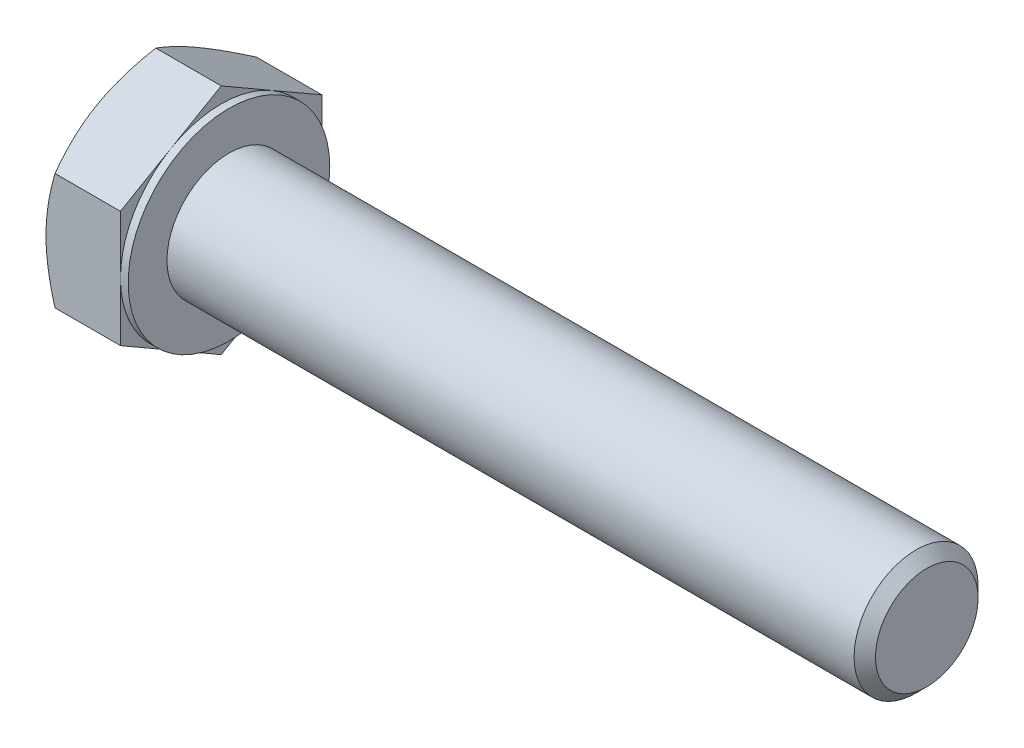
ISO-10303-21;
HEADER;
FILE_DESCRIPTION(('STEP AP214'),'2;1');
FILE_NAME('part.step','',(''),(''),'','','');
FILE_SCHEMA(('AUTOMOTIVE_DESIGN { 1 0 10303 214 1 1 1 1 }'));
ENDSEC;
DATA;
#1=APPLICATION_CONTEXT('core data for automotive mechanical design processes');
#2=APPLICATION_PROTOCOL_DEFINITION('international standard','automotive_design',2000,#1);
#3=PRODUCT_CONTEXT('',#1,'mechanical');
#4=PRODUCT('Part','Part','',(#3));
#5=PRODUCT_RELATED_PRODUCT_CATEGORY('part','',(#4));
#6=PRODUCT_DEFINITION_FORMATION('','',#4);
#7=PRODUCT_DEFINITION_CONTEXT('part definition',#1,'design');
#8=PRODUCT_DEFINITION('design','',#6,#7);
#9=PRODUCT_DEFINITION_SHAPE('','',#8);
#10=(LENGTH_UNIT() NAMED_UNIT(*) SI_UNIT(.MILLI.,.METRE.));
#11=(NAMED_UNIT(*) PLANE_ANGLE_UNIT() SI_UNIT($,.RADIAN.));
#12=(NAMED_UNIT(*) SI_UNIT($,.STERADIAN.) SOLID_ANGLE_UNIT());
#13=UNCERTAINTY_MEASURE_WITH_UNIT(LENGTH_MEASURE(1.E-05),#10,'distance_accuracy_value','');
#14=(GEOMETRIC_REPRESENTATION_CONTEXT(3) GLOBAL_UNCERTAINTY_ASSIGNED_CONTEXT((#13)) GLOBAL_UNIT_ASSIGNED_CONTEXT((#10,
#11,#12)) REPRESENTATION_CONTEXT('',''));
#15=CARTESIAN_POINT('',(0.,0.,0.));
#16=DIRECTION('',(0.,0.,1.));
#17=DIRECTION('',(1.,0.,0.));
#18=AXIS2_PLACEMENT_3D('',#15,#16,#17);
#19=CARTESIAN_POINT('',(5.3,7.50555349946514,0.));
#20=DIRECTION('',(1.,0.,0.));
#21=DIRECTION('',(0.,0.,-1.));
#22=AXIS2_PLACEMENT_3D('',#19,#20,#21);
#23=PLANE('',#22);
#24=CARTESIAN_POINT('',(5.3,0.,0.));
#25=DIRECTION('',(1.,0.,0.));
#26=DIRECTION('',(0.,0.,-1.));
#27=AXIS2_PLACEMENT_3D('',#24,#25,#26);
#28=CIRCLE('',#27,4.);
#29=CARTESIAN_POINT('',(5.3,0.,-4.));
#30=VERTEX_POINT('',#29);
#31=EDGE_CURVE('E314',#30,#30,#28,.F.);
#32=ORIENTED_EDGE('',*,*,#31,.T.);
#33=EDGE_LOOP('',(#32));
#34=FACE_BOUND('',#33,.T.);
#35=CARTESIAN_POINT('',(5.3,0.,0.));
#36=DIRECTION('',(1.,0.,0.));
#37=DIRECTION('',(0.,0.,-1.));
#38=AXIS2_PLACEMENT_3D('',#35,#36,#37);
#39=CIRCLE('',#38,6.5);
#40=CARTESIAN_POINT('',(5.3,0.,-6.5));
#41=VERTEX_POINT('',#40);
#42=EDGE_CURVE('E341',#41,#41,#39,.T.);
#43=ORIENTED_EDGE('',*,*,#42,.T.);
#44=EDGE_LOOP('',(#43));
#45=FACE_BOUND('',#44,.T.);
#46=ADVANCED_FACE('F51',(#34,#45),#23,.T.);
#47=CARTESIAN_POINT('',(0.,0.,0.));
#48=DIRECTION('',(-1.,0.,0.));
#49=DIRECTION('',(0.,0.,1.));
#50=AXIS2_PLACEMENT_3D('',#47,#48,#49);
#51=CYLINDRICAL_SURFACE('',#50,4.);
#52=ORIENTED_EDGE('',*,*,#31,.F.);
#53=EDGE_LOOP('',(#52));
#54=FACE_BOUND('',#53,.T.);
#55=CARTESIAN_POINT('',(49.6095,0.,0.));
#56=DIRECTION('',(-1.,0.,0.));
#57=DIRECTION('',(0.,0.,1.));
#58=AXIS2_PLACEMENT_3D('',#55,#56,#57);
#59=CIRCLE('',#58,4.);
#60=CARTESIAN_POINT('',(49.6095,0.,4.));
#61=VERTEX_POINT('',#60);
#62=EDGE_CURVE('E308',#61,#61,#59,.T.);
#63=ORIENTED_EDGE('',*,*,#62,.T.);
#64=EDGE_LOOP('',(#63));
#65=FACE_BOUND('',#64,.T.);
#66=ADVANCED_FACE('F279',(#54,#65),#51,.T.);
#67=CARTESIAN_POINT('',(50.3,0.,0.));
#68=DIRECTION('',(-1.,0.,0.));
#69=DIRECTION('',(0.,0.,1.));
#70=AXIS2_PLACEMENT_3D('',#67,#68,#69);
#71=CONICAL_SURFACE('',#70,3.3095,0.785398163397441);
#72=ORIENTED_EDGE('',*,*,#62,.F.);
#73=EDGE_LOOP('',(#72));
#74=FACE_BOUND('',#73,.T.);
#75=CARTESIAN_POINT('',(50.3,0.,0.));
#76=DIRECTION('',(-1.,0.,0.));
#77=DIRECTION('',(0.,0.,1.));
#78=AXIS2_PLACEMENT_3D('',#75,#76,#77);
#79=CIRCLE('',#78,3.3095);
#80=CARTESIAN_POINT('',(50.3,0.,3.3095));
#81=VERTEX_POINT('',#80);
#82=EDGE_CURVE('E305',#81,#81,#79,.T.);
#83=ORIENTED_EDGE('',*,*,#82,.T.);
#84=EDGE_LOOP('',(#83));
#85=FACE_BOUND('',#84,.T.);
#86=ADVANCED_FACE('F286',(#74,#85),#71,.T.);
#87=CARTESIAN_POINT('',(50.3,0.,0.));
#88=DIRECTION('',(-1.,0.,0.));
#89=DIRECTION('',(0.,0.,1.));
#90=AXIS2_PLACEMENT_3D('',#87,#88,#89);
#91=PLANE('',#90);
#92=ORIENTED_EDGE('',*,*,#82,.F.);
#93=EDGE_LOOP('',(#92));
#94=FACE_BOUND('',#93,.T.);
#95=ADVANCED_FACE('F293',(#94),#91,.F.);
#96=CARTESIAN_POINT('',(4.8,6.5,0.));
#97=DIRECTION('',(1.,0.,0.));
#98=DIRECTION('',(0.,0.,-1.));
#99=AXIS2_PLACEMENT_3D('',#96,#97,#98);
#100=PLANE('',#99);
#101=DIRECTION('',(0.,0.500000000000001,0.866025403784438));
#102=VECTOR('',#101,1.);
#103=CARTESIAN_POINT('',(4.8,3.75277674973256,-6.5));
#104=LINE('',#103,#102);
#105=CARTESIAN_POINT('',(4.8,3.75277674973256,-6.5));
#106=VERTEX_POINT('',#105);
#107=CARTESIAN_POINT('',(4.8,5.62916512459885,-3.25000000000001));
#108=VERTEX_POINT('',#107);
#109=EDGE_CURVE('E193',#106,#108,#104,.T.);
#110=ORIENTED_EDGE('',*,*,#109,.T.);
#111=CARTESIAN_POINT('',(4.8,0.,0.));
#112=DIRECTION('',(-1.,0.,0.));
#113=DIRECTION('',(0.,0.,1.));
#114=AXIS2_PLACEMENT_3D('',#111,#112,#113);
#115=CIRCLE('',#114,6.5);
#116=CARTESIAN_POINT('',(4.8,0.,-6.5));
#117=VERTEX_POINT('',#116);
#118=EDGE_CURVE('E68',#108,#117,#115,.T.);
#119=ORIENTED_EDGE('',*,*,#118,.T.);
#120=DIRECTION('',(0.,1.,0.));
#121=VECTOR('',#120,1.);
#122=CARTESIAN_POINT('',(4.8,3.75277674973256,-6.5));
#123=LINE('',#122,#121);
#124=EDGE_CURVE('E56',#117,#106,#123,.T.);
#125=ORIENTED_EDGE('',*,*,#124,.T.);
#126=EDGE_LOOP('',(#110,#119,#125));
#127=FACE_BOUND('',#126,.T.);
#128=ADVANCED_FACE('F296',(#127),#100,.T.);
#129=CARTESIAN_POINT('',(4.8,7.50555349946514,0.));
#130=VERTEX_POINT('',#129);
#131=EDGE_CURVE('E190',#108,#130,#104,.T.);
#132=ORIENTED_EDGE('',*,*,#131,.T.);
#133=DIRECTION('',(0.,-0.500000000000001,0.866025403784438));
#134=VECTOR('',#133,1.);
#135=CARTESIAN_POINT('',(4.8,7.50555349946514,0.));
#136=LINE('',#135,#134);
#137=CARTESIAN_POINT('',(4.8,5.62916512459885,3.25000000000001));
#138=VERTEX_POINT('',#137);
#139=EDGE_CURVE('E189',#130,#138,#136,.T.);
#140=ORIENTED_EDGE('',*,*,#139,.T.);
#141=EDGE_CURVE('E173',#138,#108,#115,.T.);
#142=ORIENTED_EDGE('',*,*,#141,.T.);
#143=EDGE_LOOP('',(#132,#140,#142));
#144=FACE_BOUND('',#143,.T.);
#145=ADVANCED_FACE('F301',(#144),#100,.T.);
#146=CARTESIAN_POINT('',(4.8,3.75277674973256,6.5));
#147=VERTEX_POINT('',#146);
#148=EDGE_CURVE('E150',#138,#147,#136,.T.);
#149=ORIENTED_EDGE('',*,*,#148,.T.);
#150=DIRECTION('',(0.,-1.,0.));
#151=VECTOR('',#150,1.);
#152=CARTESIAN_POINT('',(4.8,3.75277674973256,6.5));
#153=LINE('',#152,#151);
#154=CARTESIAN_POINT('',(4.8,0.,6.5));
#155=VERTEX_POINT('',#154);
#156=EDGE_CURVE('E144',#147,#155,#153,.T.);
#157=ORIENTED_EDGE('',*,*,#156,.T.);
#158=EDGE_CURVE('E148',#155,#138,#115,.T.);
#159=ORIENTED_EDGE('',*,*,#158,.T.);
#160=EDGE_LOOP('',(#149,#157,#159));
#161=FACE_BOUND('',#160,.T.);
#162=ADVANCED_FACE('F146',(#161),#100,.T.);
#163=CARTESIAN_POINT('',(4.8,-3.75277674973256,6.5));
#164=VERTEX_POINT('',#163);
#165=EDGE_CURVE('E155',#155,#164,#153,.T.);
#166=ORIENTED_EDGE('',*,*,#165,.T.);
#167=DIRECTION('',(0.,-0.500000000000002,-0.866025403784437));
#168=VECTOR('',#167,1.);
#169=CARTESIAN_POINT('',(4.8,-7.50555349946515,0.));
#170=LINE('',#169,#168);
#171=CARTESIAN_POINT('',(4.8,-5.62916512459884,3.25000000000001));
#172=VERTEX_POINT('',#171);
#173=EDGE_CURVE('E162',#164,#172,#170,.T.);
#174=ORIENTED_EDGE('',*,*,#173,.T.);
#175=EDGE_CURVE('E159',#172,#155,#115,.T.);
#176=ORIENTED_EDGE('',*,*,#175,.T.);
#177=EDGE_LOOP('',(#166,#174,#176));
#178=FACE_BOUND('',#177,.T.);
#179=ADVANCED_FACE('F160',(#178),#100,.T.);
#180=CARTESIAN_POINT('',(4.8,-7.50555349946515,0.));
#181=VERTEX_POINT('',#180);
#182=EDGE_CURVE('E183',#172,#181,#170,.T.);
#183=ORIENTED_EDGE('',*,*,#182,.T.);
#184=DIRECTION('',(0.,0.5,-0.866025403784439));
#185=VECTOR('',#184,1.);
#186=CARTESIAN_POINT('',(4.8,-3.75277674973258,-6.5));
#187=LINE('',#186,#185);
#188=CARTESIAN_POINT('',(4.8,-5.62916512459885,-3.25));
#189=VERTEX_POINT('',#188);
#190=EDGE_CURVE('E418',#181,#189,#187,.T.);
#191=ORIENTED_EDGE('',*,*,#190,.T.);
#192=EDGE_CURVE('E167',#189,#172,#115,.T.);
#193=ORIENTED_EDGE('',*,*,#192,.T.);
#194=EDGE_LOOP('',(#183,#191,#193));
#195=FACE_BOUND('',#194,.T.);
#196=ADVANCED_FACE('F428',(#195),#100,.T.);
#197=CARTESIAN_POINT('',(4.8,-3.75277674973258,-6.5));
#198=VERTEX_POINT('',#197);
#199=EDGE_CURVE('E175',#189,#198,#187,.T.);
#200=ORIENTED_EDGE('',*,*,#199,.T.);
#201=EDGE_CURVE('E11',#198,#117,#123,.T.);
#202=ORIENTED_EDGE('',*,*,#201,.T.);
#203=EDGE_CURVE('E412',#117,#189,#115,.T.);
#204=ORIENTED_EDGE('',*,*,#203,.T.);
#205=EDGE_LOOP('',(#200,#202,#204));
#206=FACE_BOUND('',#205,.T.);
#207=ADVANCED_FACE('F302',(#206),#100,.T.);
#208=CARTESIAN_POINT('',(0.,0.,0.));
#209=DIRECTION('',(-1.,0.,0.));
#210=DIRECTION('',(0.,0.,1.));
#211=AXIS2_PLACEMENT_3D('',#208,#209,#210);
#212=CYLINDRICAL_SURFACE('',#211,6.5);
#213=ORIENTED_EDGE('',*,*,#118,.F.);
#214=ORIENTED_EDGE('',*,*,#141,.F.);
#215=ORIENTED_EDGE('',*,*,#158,.F.);
#216=ORIENTED_EDGE('',*,*,#175,.F.);
#217=ORIENTED_EDGE('',*,*,#192,.F.);
#218=ORIENTED_EDGE('',*,*,#203,.F.);
#219=EDGE_LOOP('',(#213,#214,#215,#216,#217,#218));
#220=FACE_BOUND('',#219,.T.);
#221=ORIENTED_EDGE('',*,*,#42,.F.);
#222=EDGE_LOOP('',(#221));
#223=FACE_BOUND('',#222,.T.);
#224=ADVANCED_FACE('F170',(#220,#223),#212,.T.);
#225=CARTESIAN_POINT('',(0.,7.50555349946514,0.));
#226=DIRECTION('',(1.,0.,0.));
#227=DIRECTION('',(0.,0.,-1.));
#228=AXIS2_PLACEMENT_3D('',#225,#226,#227);
#229=PLANE('',#228);
#230=CARTESIAN_POINT('',(0.,0.,0.));
#231=DIRECTION('',(1.,0.,0.));
#232=DIRECTION('',(0.,0.,-1.));
#233=AXIS2_PLACEMENT_3D('',#230,#231,#232);
#234=CIRCLE('',#233,6.5);
#235=CARTESIAN_POINT('',(0.,0.,-6.5));
#236=VERTEX_POINT('',#235);
#237=CARTESIAN_POINT('',(0.,5.62916512459885,-3.25000000000001));
#238=VERTEX_POINT('',#237);
#239=EDGE_CURVE('E340',#236,#238,#234,.T.);
#240=ORIENTED_EDGE('',*,*,#239,.F.);
#241=CARTESIAN_POINT('',(0.,-5.62916512459885,-3.25));
#242=VERTEX_POINT('',#241);
#243=EDGE_CURVE('E336',#242,#236,#234,.T.);
#244=ORIENTED_EDGE('',*,*,#243,.F.);
#245=CARTESIAN_POINT('',(0.,-5.62916512459884,3.25000000000001));
#246=VERTEX_POINT('',#245);
#247=EDGE_CURVE('E339',#246,#242,#234,.T.);
#248=ORIENTED_EDGE('',*,*,#247,.F.);
#249=CARTESIAN_POINT('',(0.,0.,6.5));
#250=VERTEX_POINT('',#249);
#251=EDGE_CURVE('E355',#250,#246,#234,.T.);
#252=ORIENTED_EDGE('',*,*,#251,.F.);
#253=CARTESIAN_POINT('',(0.,0.,0.));
#254=DIRECTION('',(-1.,0.,0.));
#255=DIRECTION('',(0.,0.,1.));
#256=AXIS2_PLACEMENT_3D('',#253,#254,#255);
#257=CIRCLE('',#256,6.5);
#258=CARTESIAN_POINT('',(0.,5.62916512459885,3.25000000000001));
#259=VERTEX_POINT('',#258);
#260=EDGE_CURVE('E194',#250,#259,#257,.T.);
#261=ORIENTED_EDGE('',*,*,#260,.T.);
#262=EDGE_CURVE('E348',#238,#259,#234,.T.);
#263=ORIENTED_EDGE('',*,*,#262,.F.);
#264=EDGE_LOOP('',(#240,#244,#248,#252,#261,#263));
#265=FACE_BOUND('',#264,.T.);
#266=ADVANCED_FACE('F227',(#265),#229,.F.);
#267=CARTESIAN_POINT('',(0.,0.,0.));
#268=DIRECTION('',(1.,0.,0.));
#269=DIRECTION('',(0.,0.,-1.));
#270=AXIS2_PLACEMENT_3D('',#267,#268,#269);
#271=CONICAL_SURFACE('',#270,6.5,1.0471975511966);
#272=CARTESIAN_POINT('',(0.580623251805864,3.75266127967873,6.5002));
#273=CARTESIAN_POINT('',(0.533004423075483,3.8351516191275,6.35732254094112));
#274=CARTESIAN_POINT('',(0.487546700602703,3.91794952254312,6.21391236546508));
#275=CARTESIAN_POINT('',(0.401548682023043,4.08421773795794,5.9259273686828));
#276=CARTESIAN_POINT('',(0.361010507228023,4.16768832359105,5.78135207342873));
#277=CARTESIAN_POINT('',(0.247571001123207,4.41943655294051,5.34531134947996));
#278=CARTESIAN_POINT('',(0.183047807128738,4.58870793403689,5.05212471715368));
#279=CARTESIAN_POINT('',(0.10738658354749,4.84201947708215,4.61337625445563));
#280=CARTESIAN_POINT('',(0.0858328564569865,4.92530276780316,4.46912536350531));
#281=CARTESIAN_POINT('',(0.0496903146061184,5.09224566542477,4.17997178286191));
#282=CARTESIAN_POINT('',(0.035100884459666,5.17590523841627,4.03506915190111));
#283=CARTESIAN_POINT('',(0.0132587525073465,5.34336968579964,3.74501222057168));
#284=CARTESIAN_POINT('',(0.00599772432210776,5.427174286676,3.59985839394579));
#285=CARTESIAN_POINT('',(-0.00103969741776825,5.59485627940483,3.30942466302505));
#286=CARTESIAN_POINT('',(-0.000816322187794847,5.6787336689286,3.16414476276364));
#287=CARTESIAN_POINT('',(0.010083458515166,5.90853103021317,2.76612405757351));
#288=CARTESIAN_POINT('',(0.0283818178694139,6.05437578112763,2.51351353897243));
#289=CARTESIAN_POINT('',(0.0864063414576756,6.34509659313135,2.00997032176432));
#290=CARTESIAN_POINT('',(0.126152338538245,6.48997163178545,1.75903939406692));
#291=CARTESIAN_POINT('',(0.22550590320215,6.78127752911039,1.25448277935568));
#292=CARTESIAN_POINT('',(0.285534425638028,6.92767163007068,1.00092075856409));
#293=CARTESIAN_POINT('',(0.42177499250987,7.21827667013277,0.497578064240955));
#294=CARTESIAN_POINT('',(0.497955034163595,7.36249133098589,0.247790944447036));
#295=CARTESIAN_POINT('',(0.580623251805869,7.50566896951898,-0.000199999999999938));
#296=B_SPLINE_CURVE_WITH_KNOTS('',3,(#272,#273,#274,#275,#276,#277,#278,#279,#280,#281,#282,
#283,#284,#285,#286,#287,#288,#289,#290,#291,#292,#293,#294,#295),.UNSPECIFIED.,.F.,.F.,(4,2,2,
2,2,2,2,2,2,2,2,4),(0.,0.515105052395588,1.03043143507525,2.06322554824262,2.56697389547996,
3.07067772176454,3.57380860368928,4.0769239424252,4.9527935470566,5.82947446853466,
6.72559912449736,7.61996451221046),.UNSPECIFIED.);
#297=CARTESIAN_POINT('',(0.580556583600765,7.50555349946514,0.));
#298=VERTEX_POINT('',#297);
#299=EDGE_CURVE('E247',#259,#298,#296,.T.);
#300=ORIENTED_EDGE('',*,*,#299,.T.);
#301=CARTESIAN_POINT('',(0.580623251805869,7.50566896951898,0.000200000000000058));
#302=CARTESIAN_POINT('',(0.533004423075487,7.4231786300702,-0.14267745905888));
#303=CARTESIAN_POINT('',(0.487546700602708,7.34038072665458,-0.286087634534913));
#304=CARTESIAN_POINT('',(0.401548682023048,7.17411251123976,-0.574072631317195));
#305=CARTESIAN_POINT('',(0.361010507228027,7.09064192560665,-0.718647926571264));
#306=CARTESIAN_POINT('',(0.24757100112321,6.83889369625719,-1.15468865052003));
#307=CARTESIAN_POINT('',(0.18304780712874,6.66962231516081,-1.44787528284632));
#308=CARTESIAN_POINT('',(0.107386583547492,6.41631077211555,-1.88662374554437));
#309=CARTESIAN_POINT('',(0.0858328564569873,6.33302748139454,-2.03087463649469));
#310=CARTESIAN_POINT('',(0.0496903146061189,6.16608458377293,-2.32002821713809));
#311=CARTESIAN_POINT('',(0.0351008844596667,6.08242501078143,-2.46493084809889));
#312=CARTESIAN_POINT('',(0.0132587525073468,5.91496056339806,-2.75498777942832));
#313=CARTESIAN_POINT('',(0.00599772432210739,5.8311559625217,-2.90014160605421));
#314=CARTESIAN_POINT('',(-0.00103969741776939,5.66347396979287,-3.19057533697495));
#315=CARTESIAN_POINT('',(-0.000816322187796096,5.5795965802691,-3.33585523723636));
#316=CARTESIAN_POINT('',(0.0100834585151643,5.34979921898453,-3.73387594242649));
#317=CARTESIAN_POINT('',(0.028381817869412,5.20395446807007,-3.98648646102757));
#318=CARTESIAN_POINT('',(0.0864063414576732,4.91323365606635,-4.49002967823568));
#319=CARTESIAN_POINT('',(0.126152338538243,4.76835861741225,-4.74096060593308));
#320=CARTESIAN_POINT('',(0.225505903202147,4.47705272008731,-5.24551722064432));
#321=CARTESIAN_POINT('',(0.285534425638024,4.33065861912702,-5.49907924143591));
#322=CARTESIAN_POINT('',(0.421774992509865,4.04005357906493,-6.00242193575904));
#323=CARTESIAN_POINT('',(0.497955034163589,3.89583891821181,-6.25220905555296));
#324=CARTESIAN_POINT('',(0.580623251805864,3.75266127967872,-6.5002));
#325=B_SPLINE_CURVE_WITH_KNOTS('',3,(#301,#302,#303,#304,#305,#306,#307,#308,#309,#310,#311,
#312,#313,#314,#315,#316,#317,#318,#319,#320,#321,#322,#323,#324),.UNSPECIFIED.,.F.,.F.,(4,2,2,
2,2,2,2,2,2,2,2,4),(0.,0.515105052395587,1.03043143507525,2.06322554824262,2.56697389547996,
3.07067772176454,3.57380860368928,4.0769239424252,4.9527935470566,5.82947446853466,
6.72559912449737,7.61996451221046),.UNSPECIFIED.);
#326=EDGE_CURVE('E76',#298,#238,#325,.T.);
#327=ORIENTED_EDGE('',*,*,#326,.T.);
#328=ORIENTED_EDGE('',*,*,#262,.T.);
#329=EDGE_LOOP('',(#300,#327,#328));
#330=FACE_BOUND('',#329,.T.);
#331=ADVANCED_FACE('F440',(#330),#271,.T.);
#332=CARTESIAN_POINT('',(3.18835311590245,-10.1137456678934,6.5));
#333=CARTESIAN_POINT('',(3.05034774010467,-9.82952666322136,6.5));
#334=CARTESIAN_POINT('',(2.91365616489937,-9.54465869649272,6.5));
#335=CARTESIAN_POINT('',(2.64363899497541,-8.9732797805792,6.5));
#336=CARTESIAN_POINT('',(2.51031392459096,-8.6867685838847,6.5));
#337=CARTESIAN_POINT('',(2.24710473482718,-8.11029837842687,6.5));
#338=CARTESIAN_POINT('',(2.11724300438679,-7.8203291120151,6.5));
#339=CARTESIAN_POINT('',(1.86279082826902,-7.23809541022338,6.5));
#340=CARTESIAN_POINT('',(1.73820013554674,-6.94583108317206,6.5));
#341=CARTESIAN_POINT('',(1.49176685426961,-6.34906440963034,6.5));
#342=CARTESIAN_POINT('',(1.37014257641265,-6.04447142288871,6.5));
#343=CARTESIAN_POINT('',(1.13601865758149,-5.43173420957314,6.5));
#344=CARTESIAN_POINT('',(1.02352003558022,-5.12358959079844,6.5));
#345=CARTESIAN_POINT('',(0.810575368239913,-4.50382569782258,6.5));
#346=CARTESIAN_POINT('',(0.710105232302001,-4.19221478266991,6.5));
#347=CARTESIAN_POINT('',(0.52442016614445,-3.56452019206011,6.5));
#348=CARTESIAN_POINT('',(0.439200468206414,-3.2484379479292,6.5));
#349=CARTESIAN_POINT('',(0.288524223401194,-2.61335465712781,6.5));
#350=CARTESIAN_POINT('',(0.222961865744746,-2.29437912059504,6.5));
#351=CARTESIAN_POINT('',(0.115312883130723,-1.65238219405861,6.5));
#352=CARTESIAN_POINT('',(0.0732239014690616,-1.32936121354429,6.5));
#353=CARTESIAN_POINT('',(0.0304887136381653,-0.845231171839973,6.5));
#354=CARTESIAN_POINT('',(0.0196493434273834,-0.684982209663091,6.5));
#355=CARTESIAN_POINT('',(0.00475298486143938,-0.364162349065448,6.5));
#356=CARTESIAN_POINT('',(0.000695882908831688,-0.203591456081868,6.5));
#357=CARTESIAN_POINT('',(-0.00053159719009514,0.117577430374309,6.5));
#358=CARTESIAN_POINT('',(0.00229809017012696,0.278175424090154,6.5));
#359=CARTESIAN_POINT('',(0.0147726845547643,0.599108972823517,6.5));
#360=CARTESIAN_POINT('',(0.0244179260500524,0.759444514574229,6.5));
#361=CARTESIAN_POINT('',(0.055496193934301,1.14369946602535,6.5));
#362=CARTESIAN_POINT('',(0.0801030490514528,1.36736763045087,6.5));
#363=CARTESIAN_POINT('',(0.141246537453379,1.81305591311689,6.5));
#364=CARTESIAN_POINT('',(0.177784759614454,2.0350758078311,6.5));
#365=CARTESIAN_POINT('',(0.303360001332118,2.69839633433797,6.5));
#366=CARTESIAN_POINT('',(0.408335815147598,3.13672010374358,6.5));
#367=CARTESIAN_POINT('',(0.590564593134944,3.7923211291812,6.5));
#368=CARTESIAN_POINT('',(0.656313198979096,4.01299150874074,6.5));
#369=CARTESIAN_POINT('',(0.794681634200736,4.45218859008392,6.5));
#370=CARTESIAN_POINT('',(0.867301513122622,4.6707152763982,6.5));
#371=CARTESIAN_POINT('',(1.01824353854295,5.10569490252727,6.5));
#372=CARTESIAN_POINT('',(1.09656388232839,5.32214847365077,6.5));
#373=CARTESIAN_POINT('',(1.25798086164822,5.7532572577304,6.5));
#374=CARTESIAN_POINT('',(1.34107741035996,5.96791250329558,6.5));
#375=CARTESIAN_POINT('',(1.56029019583042,6.51888445936374,6.5));
#376=CARTESIAN_POINT('',(1.69936356666534,6.85402316813628,6.5));
#377=CARTESIAN_POINT('',(1.98501958087353,7.52109583939394,6.5));
#378=CARTESIAN_POINT('',(2.13160288780792,7.85302951559934,6.5));
#379=CARTESIAN_POINT('',(2.43059748044952,8.51437865518658,6.5));
#380=CARTESIAN_POINT('',(2.5830105759696,8.84379329784094,6.5));
#381=CARTESIAN_POINT('',(2.89234869374927,9.50047798683785,6.5));
#382=CARTESIAN_POINT('',(3.04927357220059,9.82774810112758,6.5));
#383=CARTESIAN_POINT('',(3.36692013130637,10.4809971975748,6.5));
#384=CARTESIAN_POINT('',(3.52764676491733,10.8069737667408,6.5));
#385=CARTESIAN_POINT('',(3.851985555549,11.4574882901034,6.5));
#386=CARTESIAN_POINT('',(4.01559773123065,11.7820262349792,6.5));
#387=CARTESIAN_POINT('',(4.50986185003773,12.7537468114441,6.5));
#388=CARTESIAN_POINT('',(4.84399997978541,13.3991555932469,6.5));
#389=CARTESIAN_POINT('',(5.48575990265919,14.6239779290894,6.5));
#390=CARTESIAN_POINT('',(5.79279643372278,15.2036995760604,6.5));
#391=CARTESIAN_POINT('',(6.4106918822763,16.3611382637875,6.5));
#392=CARTESIAN_POINT('',(6.72155099010109,16.938855202873,6.49999999999999));
#393=CARTESIAN_POINT('',(7.34519775439014,18.0910273555999,6.49999999999999));
#394=CARTESIAN_POINT('',(7.65797694168864,18.665487160613,6.49999999999999));
#395=CARTESIAN_POINT('',(8.28574397153078,19.8131486204439,6.49999999999999));
#396=CARTESIAN_POINT('',(8.60073166294278,20.3863503578957,6.49999999999999));
#397=CARTESIAN_POINT('',(8.91652967168741,20.9591024521449,6.49999999999999));
#398=B_SPLINE_CURVE_WITH_KNOTS('',3,(#332,#333,#334,#335,#336,#337,#338,#339,#340,#341,#342,
#343,#344,#345,#346,#347,#348,#349,#350,#351,#352,#353,#354,#355,#356,#357,#358,#359,#360,#361,
#362,#363,#364,#365,#366,#367,#368,#369,#370,#371,#372,#373,#374,#375,#376,#377,#378,#379,#380,
#381,#382,#383,#384,#385,#386,#387,#388,#389,#390,#391,#392,#393,#394,#395,#396,#397),
.UNSPECIFIED.,.F.,.F.,(4,2,2,2,2,2,2,2,2,2,2,2,2,2,2,2,2,2,2,2,2,2,2,2,2,2,2,2,2,2,2,2,4),(0.,
0.947868666702312,1.89588406483492,2.84900320930536,3.80207763304314,4.7858977408271,
5.76982755141752,6.75175256246684,7.73337005764393,8.70960474890991,9.68574140951123,
10.1674651053568,10.6491807326436,11.1309009419855,11.6126447932157,12.287317572382,
12.9620802330383,14.312318438093,15.0030310344276,15.6937486114326,16.384248697357,
17.0747362352244,18.1631508683747,19.2516618378193,20.3405135142583,21.4293305231019,
22.5196540547636,23.6099846401957,25.7902468235016,27.7582608872417,29.7263733429304,
31.6886408595598,33.6507753806319),.UNSPECIFIED.);
#399=CARTESIAN_POINT('',(0.58055658360076,3.75277674973256,6.5));
#400=VERTEX_POINT('',#399);
#401=EDGE_CURVE('E262',#250,#400,#398,.T.);
#402=ORIENTED_EDGE('',*,*,#401,.T.);
#403=EDGE_CURVE('E261',#400,#259,#296,.T.);
#404=ORIENTED_EDGE('',*,*,#403,.T.);
#405=ORIENTED_EDGE('',*,*,#260,.F.);
#406=EDGE_LOOP('',(#402,#404,#405));
#407=FACE_BOUND('',#406,.T.);
#408=ADVANCED_FACE('F438',(#407),#271,.T.);
#409=CARTESIAN_POINT('',(0.58055658360076,-3.75277674973256,6.5));
#410=VERTEX_POINT('',#409);
#411=EDGE_CURVE('E309',#410,#250,#398,.T.);
#412=ORIENTED_EDGE('',*,*,#411,.T.);
#413=ORIENTED_EDGE('',*,*,#251,.T.);
#414=CARTESIAN_POINT('',(0.580623251805873,-7.50566896951898,-0.000200000000000038));
#415=CARTESIAN_POINT('',(0.533004423075492,-7.42317863007021,0.142677459058881));
#416=CARTESIAN_POINT('',(0.487546700602712,-7.34038072665459,0.286087634534913));
#417=CARTESIAN_POINT('',(0.401548682023051,-7.17411251123976,0.574072631317195));
#418=CARTESIAN_POINT('',(0.361010507228031,-7.09064192560666,0.718647926571264));
#419=CARTESIAN_POINT('',(0.247571001123213,-6.8388936962572,1.15468865052003));
#420=CARTESIAN_POINT('',(0.183047807128743,-6.66962231516081,1.44787528284632));
#421=CARTESIAN_POINT('',(0.107386583547495,-6.41631077211556,1.88662374554437));
#422=CARTESIAN_POINT('',(0.0858328564569905,-6.33302748139455,2.03087463649469));
#423=CARTESIAN_POINT('',(0.0496903146061219,-6.16608458377294,2.32002821713809));
#424=CARTESIAN_POINT('',(0.0351008844596694,-6.08242501078143,2.46493084809889));
#425=CARTESIAN_POINT('',(0.013258752507349,-5.91496056339807,2.75498777942832));
#426=CARTESIAN_POINT('',(0.00599772432210962,-5.83115596252171,2.90014160605421));
#427=CARTESIAN_POINT('',(-0.00103969741776735,-5.66347396979287,3.19057533697495));
#428=CARTESIAN_POINT('',(-0.000816322187794218,-5.5795965802691,3.33585523723636));
#429=CARTESIAN_POINT('',(0.0100834585151659,-5.34979921898453,3.73387594242649));
#430=CARTESIAN_POINT('',(0.0283818178694134,-5.20395446807007,3.98648646102757));
#431=CARTESIAN_POINT('',(0.0864063414576743,-4.91323365606635,4.49002967823568));
#432=CARTESIAN_POINT('',(0.126152338538244,-4.76835861741226,4.74096060593308));
#433=CARTESIAN_POINT('',(0.225505903202148,-4.47705272008731,5.24551722064432));
#434=CARTESIAN_POINT('',(0.285534425638024,-4.33065861912702,5.49907924143591));
#435=CARTESIAN_POINT('',(0.421774992509865,-4.04005357906493,6.00242193575904));
#436=CARTESIAN_POINT('',(0.497955034163589,-3.89583891821181,6.25220905555296));
#437=CARTESIAN_POINT('',(0.580623251805864,-3.75266127967872,6.5002));
#438=B_SPLINE_CURVE_WITH_KNOTS('',3,(#414,#415,#416,#417,#418,#419,#420,#421,#422,#423,#424,
#425,#426,#427,#428,#429,#430,#431,#432,#433,#434,#435,#436,#437),.UNSPECIFIED.,.F.,.F.,(4,2,2,
2,2,2,2,2,2,2,2,4),(0.,0.515105052395589,1.03043143507525,2.06322554824263,2.56697389547997,
3.07067772176454,3.57380860368928,4.07692394242521,4.95279354705661,5.82947446853467,
6.72559912449737,7.61996451221046),.UNSPECIFIED.);
#439=EDGE_CURVE('E249',#246,#410,#438,.T.);
#440=ORIENTED_EDGE('',*,*,#439,.T.);
#441=EDGE_LOOP('',(#412,#413,#440));
#442=FACE_BOUND('',#441,.T.);
#443=ADVANCED_FACE('F216',(#442),#271,.T.);
#444=CARTESIAN_POINT('',(0.580556583600769,-7.50555349946515,0.));
#445=VERTEX_POINT('',#444);
#446=EDGE_CURVE('E240',#445,#246,#438,.T.);
#447=ORIENTED_EDGE('',*,*,#446,.T.);
#448=ORIENTED_EDGE('',*,*,#247,.T.);
#449=CARTESIAN_POINT('',(0.58062325180587,-3.75266127967874,-6.5002));
#450=CARTESIAN_POINT('',(0.533004423075488,-3.83515161912751,-6.35732254094112));
#451=CARTESIAN_POINT('',(0.487546700602709,-3.91794952254313,-6.21391236546509));
#452=CARTESIAN_POINT('',(0.401548682023048,-4.08421773795795,-5.9259273686828));
#453=CARTESIAN_POINT('',(0.361010507228028,-4.16768832359106,-5.78135207342874));
#454=CARTESIAN_POINT('',(0.247571001123211,-4.41943655294052,-5.34531134947996));
#455=CARTESIAN_POINT('',(0.183047807128742,-4.58870793403691,-5.05212471715368));
#456=CARTESIAN_POINT('',(0.107386583547495,-4.84201947708216,-4.61337625445563));
#457=CARTESIAN_POINT('',(0.0858328564569915,-4.92530276780317,-4.46912536350531));
#458=CARTESIAN_POINT('',(0.0496903146061235,-5.09224566542478,-4.17997178286191));
#459=CARTESIAN_POINT('',(0.0351008844596712,-5.17590523841628,-4.03506915190111));
#460=CARTESIAN_POINT('',(0.0132587525073518,-5.34336968579965,-3.74501222057168));
#461=CARTESIAN_POINT('',(0.00599772432211296,-5.42717428667601,-3.59985839394579));
#462=CARTESIAN_POINT('',(-0.00103969741776318,-5.59485627940485,-3.30942466302505));
#463=CARTESIAN_POINT('',(-0.000816322187789829,-5.67873366892861,-3.16414476276364));
#464=CARTESIAN_POINT('',(0.0100834585151709,-5.90853103021318,-2.7661240575735));
#465=CARTESIAN_POINT('',(0.0283818178694189,-6.05437578112764,-2.51351353897243));
#466=CARTESIAN_POINT('',(0.0864063414576809,-6.34509659313136,-2.00997032176432));
#467=CARTESIAN_POINT('',(0.126152338538251,-6.48997163178546,-1.75903939406692));
#468=CARTESIAN_POINT('',(0.225505903202156,-6.7812775291104,-1.25448277935568));
#469=CARTESIAN_POINT('',(0.285534425638033,-6.92767163007069,-1.00092075856409));
#470=CARTESIAN_POINT('',(0.421774992509875,-7.21827667013278,-0.497578064240955));
#471=CARTESIAN_POINT('',(0.497955034163599,-7.3624913309859,-0.247790944447036));
#472=CARTESIAN_POINT('',(0.580623251805873,-7.50566896951898,0.000200000000000128));
#473=B_SPLINE_CURVE_WITH_KNOTS('',3,(#449,#450,#451,#452,#453,#454,#455,#456,#457,#458,#459,
#460,#461,#462,#463,#464,#465,#466,#467,#468,#469,#470,#471,#472),.UNSPECIFIED.,.F.,.F.,(4,2,2,
2,2,2,2,2,2,2,2,4),(0.,0.515105052395587,1.03043143507525,2.06322554824262,2.56697389547996,
3.07067772176454,3.57380860368928,4.0769239424252,4.9527935470566,5.82947446853466,
6.72559912449736,7.61996451221046),.UNSPECIFIED.);
#474=EDGE_CURVE('E248',#242,#445,#473,.T.);
#475=ORIENTED_EDGE('',*,*,#474,.T.);
#476=EDGE_LOOP('',(#447,#448,#475));
#477=FACE_BOUND('',#476,.T.);
#478=ADVANCED_FACE('F369',(#477),#271,.T.);
#479=CARTESIAN_POINT('',(0.58055658360076,3.75277674973256,-6.5));
#480=VERTEX_POINT('',#479);
#481=EDGE_CURVE('E250',#238,#480,#325,.T.);
#482=ORIENTED_EDGE('',*,*,#481,.T.);
#483=CARTESIAN_POINT('',(3.18835311590246,-10.1137456678934,-6.5));
#484=CARTESIAN_POINT('',(3.05034774010468,-9.82952666322138,-6.5));
#485=CARTESIAN_POINT('',(2.91365616489938,-9.54465869649274,-6.5));
#486=CARTESIAN_POINT('',(2.64363899497542,-8.97327978057922,-6.5));
#487=CARTESIAN_POINT('',(2.51031392459097,-8.68676858388472,-6.5));
#488=CARTESIAN_POINT('',(2.24710473482719,-8.11029837842689,-6.5));
#489=CARTESIAN_POINT('',(2.1172430043868,-7.82032911201512,-6.5));
#490=CARTESIAN_POINT('',(1.86279082826903,-7.2380954102234,-6.5));
#491=CARTESIAN_POINT('',(1.73820013554675,-6.94583108317207,-6.5));
#492=CARTESIAN_POINT('',(1.49176685426962,-6.34906440963036,-6.5));
#493=CARTESIAN_POINT('',(1.37014257641266,-6.04447142288872,-6.5));
#494=CARTESIAN_POINT('',(1.13601865758149,-5.43173420957316,-6.5));
#495=CARTESIAN_POINT('',(1.02352003558022,-5.12358959079846,-6.5));
#496=CARTESIAN_POINT('',(0.810575368239919,-4.5038256978226,-6.5));
#497=CARTESIAN_POINT('',(0.710105232302007,-4.19221478266993,-6.5));
#498=CARTESIAN_POINT('',(0.524420166144455,-3.56452019206012,-6.5));
#499=CARTESIAN_POINT('',(0.439200468206419,-3.24843794792921,-6.5));
#500=CARTESIAN_POINT('',(0.288524223401198,-2.61335465712783,-6.5));
#501=CARTESIAN_POINT('',(0.222961865744749,-2.29437912059505,-6.5));
#502=CARTESIAN_POINT('',(0.115312883130726,-1.65238219405862,-6.5));
#503=CARTESIAN_POINT('',(0.0732239014690636,-1.3293612135443,-6.5));
#504=CARTESIAN_POINT('',(0.0304887136381666,-0.845231171839985,-6.5));
#505=CARTESIAN_POINT('',(0.0196493434273844,-0.684982209663102,-6.5));
#506=CARTESIAN_POINT('',(0.00475298486144037,-0.36416234906546,-6.5));
#507=CARTESIAN_POINT('',(0.000695882908832888,-0.203591456081879,-6.5));
#508=CARTESIAN_POINT('',(-0.000531597190094337,0.117577430374297,-6.5));
#509=CARTESIAN_POINT('',(0.00229809017012715,0.278175424090143,-6.5));
#510=CARTESIAN_POINT('',(0.0147726845547641,0.599108972823506,-6.5));
#511=CARTESIAN_POINT('',(0.0244179260500524,0.759444514574218,-6.5));
#512=CARTESIAN_POINT('',(0.0554961939343009,1.14369946602534,-6.5));
#513=CARTESIAN_POINT('',(0.0801030490514521,1.36736763045086,-6.5));
#514=CARTESIAN_POINT('',(0.141246537453378,1.81305591311688,-6.5));
#515=CARTESIAN_POINT('',(0.177784759614452,2.03507580783108,-6.5));
#516=CARTESIAN_POINT('',(0.303360001332116,2.69839633433796,-6.5));
#517=CARTESIAN_POINT('',(0.408335815147595,3.13672010374357,-6.5));
#518=CARTESIAN_POINT('',(0.59056459313494,3.79232112918118,-6.5));
#519=CARTESIAN_POINT('',(0.656313198979091,4.01299150874073,-6.5));
#520=CARTESIAN_POINT('',(0.794681634200732,4.45218859008391,-6.5));
#521=CARTESIAN_POINT('',(0.867301513122617,4.67071527639819,-6.5));
#522=CARTESIAN_POINT('',(1.01824353854295,5.10569490252726,-6.5));
#523=CARTESIAN_POINT('',(1.09656388232839,5.32214847365075,-6.5));
#524=CARTESIAN_POINT('',(1.25798086164821,5.75325725773039,-6.5));
#525=CARTESIAN_POINT('',(1.34107741035995,5.96791250329556,-6.5));
#526=CARTESIAN_POINT('',(1.56029019583041,6.51888445936372,-6.5));
#527=CARTESIAN_POINT('',(1.69936356666534,6.85402316813626,-6.5));
#528=CARTESIAN_POINT('',(1.98501958087352,7.52109583939392,-6.5));
#529=CARTESIAN_POINT('',(2.13160288780791,7.85302951559932,-6.5));
#530=CARTESIAN_POINT('',(2.43059748044951,8.51437865518657,-6.5));
#531=CARTESIAN_POINT('',(2.58301057596959,8.84379329784093,-6.5));
#532=CARTESIAN_POINT('',(2.89234869374926,9.50047798683784,-6.5));
#533=CARTESIAN_POINT('',(3.04927357220058,9.82774810112756,-6.5));
#534=CARTESIAN_POINT('',(3.36692013130636,10.4809971975748,-6.5));
#535=CARTESIAN_POINT('',(3.52764676491732,10.8069737667408,-6.5));
#536=CARTESIAN_POINT('',(3.85198555554899,11.4574882901034,-6.5));
#537=CARTESIAN_POINT('',(4.01559773123065,11.7820262349792,-6.5));
#538=CARTESIAN_POINT('',(4.50986185003773,12.753746811444,-6.5));
#539=CARTESIAN_POINT('',(4.8439999797854,13.3991555932469,-6.5));
#540=CARTESIAN_POINT('',(5.48575990265919,14.6239779290894,-6.5));
#541=CARTESIAN_POINT('',(5.79279643372278,15.2036995760604,-6.5));
#542=CARTESIAN_POINT('',(6.4106918822763,16.3611382637875,-6.5));
#543=CARTESIAN_POINT('',(6.72155099010109,16.938855202873,-6.5));
#544=CARTESIAN_POINT('',(7.34519775439014,18.0910273555999,-6.5));
#545=CARTESIAN_POINT('',(7.65797694168864,18.665487160613,-6.5));
#546=CARTESIAN_POINT('',(8.28574397153078,19.8131486204439,-6.5));
#547=CARTESIAN_POINT('',(8.60073166294279,20.3863503578957,-6.5));
#548=CARTESIAN_POINT('',(8.91652967168741,20.9591024521449,-6.49999999999999));
#549=B_SPLINE_CURVE_WITH_KNOTS('',3,(#483,#484,#485,#486,#487,#488,#489,#490,#491,#492,#493,
#494,#495,#496,#497,#498,#499,#500,#501,#502,#503,#504,#505,#506,#507,#508,#509,#510,#511,#512,
#513,#514,#515,#516,#517,#518,#519,#520,#521,#522,#523,#524,#525,#526,#527,#528,#529,#530,#531,
#532,#533,#534,#535,#536,#537,#538,#539,#540,#541,#542,#543,#544,#545,#546,#547,#548),
.UNSPECIFIED.,.F.,.F.,(4,2,2,2,2,2,2,2,2,2,2,2,2,2,2,2,2,2,2,2,2,2,2,2,2,2,2,2,2,2,2,2,4),(0.,
0.947868666702312,1.89588406483492,2.84900320930536,3.80207763304314,4.7858977408271,
5.76982755141752,6.75175256246685,7.73337005764394,8.70960474890992,9.68574140951124,
10.1674651053568,10.6491807326436,11.1309009419855,11.6126447932157,12.287317572382,
12.9620802330384,14.312318438093,15.0030310344276,15.6937486114326,16.3842486973571,
17.0747362352244,18.1631508683747,19.2516618378194,20.3405135142583,21.4293305231019,
22.5196540547636,23.6099846401957,25.7902468235016,27.7582608872418,29.7263733429304,
31.6886408595598,33.6507753806319),.UNSPECIFIED.);
#550=EDGE_CURVE('E208',#480,#236,#549,.F.);
#551=ORIENTED_EDGE('',*,*,#550,.T.);
#552=ORIENTED_EDGE('',*,*,#239,.T.);
#553=EDGE_LOOP('',(#482,#551,#552));
#554=FACE_BOUND('',#553,.T.);
#555=ADVANCED_FACE('F390',(#554),#271,.T.);
#556=CARTESIAN_POINT('',(0.580556583600765,-3.75277674973258,-6.5));
#557=VERTEX_POINT('',#556);
#558=EDGE_CURVE('E209',#557,#242,#473,.T.);
#559=ORIENTED_EDGE('',*,*,#558,.T.);
#560=ORIENTED_EDGE('',*,*,#243,.T.);
#561=EDGE_CURVE('E198',#236,#557,#549,.F.);
#562=ORIENTED_EDGE('',*,*,#561,.T.);
#563=EDGE_LOOP('',(#559,#560,#562));
#564=FACE_BOUND('',#563,.T.);
#565=ADVANCED_FACE('F225',(#564),#271,.T.);
#566=CARTESIAN_POINT('',(5.3,3.75277674973256,-6.5));
#567=DIRECTION('',(0.,0.,1.));
#568=DIRECTION('',(0.,-1.,0.));
#569=AXIS2_PLACEMENT_3D('',#566,#567,#568);
#570=PLANE('',#569);
#571=ORIENTED_EDGE('',*,*,#201,.F.);
#572=DIRECTION('',(-1.,0.,0.));
#573=VECTOR('',#572,1.);
#574=CARTESIAN_POINT('',(5.3,-3.75277674973258,-6.5));
#575=LINE('',#574,#573);
#576=EDGE_CURVE('E322',#198,#557,#575,.T.);
#577=ORIENTED_EDGE('',*,*,#576,.T.);
#578=ORIENTED_EDGE('',*,*,#561,.F.);
#579=ORIENTED_EDGE('',*,*,#550,.F.);
#580=DIRECTION('',(-1.,0.,0.));
#581=VECTOR('',#580,1.);
#582=CARTESIAN_POINT('',(5.3,3.75277674973256,-6.5));
#583=LINE('',#582,#581);
#584=EDGE_CURVE('E319',#106,#480,#583,.T.);
#585=ORIENTED_EDGE('',*,*,#584,.F.);
#586=ORIENTED_EDGE('',*,*,#124,.F.);
#587=EDGE_LOOP('',(#571,#577,#578,#579,#585,#586));
#588=FACE_BOUND('',#587,.T.);
#589=ADVANCED_FACE('F220',(#588),#570,.F.);
#590=CARTESIAN_POINT('',(5.3,-3.75277674973258,-6.5));
#591=DIRECTION('',(0.,0.866025403784438,0.5));
#592=DIRECTION('',(0.,-0.5,0.866025403784439));
#593=AXIS2_PLACEMENT_3D('',#590,#591,#592);
#594=PLANE('',#593);
#595=ORIENTED_EDGE('',*,*,#190,.F.);
#596=DIRECTION('',(-1.,0.,0.));
#597=VECTOR('',#596,1.);
#598=CARTESIAN_POINT('',(5.3,-7.50555349946515,0.));
#599=LINE('',#598,#597);
#600=EDGE_CURVE('E325',#181,#445,#599,.T.);
#601=ORIENTED_EDGE('',*,*,#600,.T.);
#602=ORIENTED_EDGE('',*,*,#474,.F.);
#603=ORIENTED_EDGE('',*,*,#558,.F.);
#604=ORIENTED_EDGE('',*,*,#576,.F.);
#605=ORIENTED_EDGE('',*,*,#199,.F.);
#606=EDGE_LOOP('',(#595,#601,#602,#603,#604,#605));
#607=FACE_BOUND('',#606,.T.);
#608=ADVANCED_FACE('F224',(#607),#594,.F.);
#609=CARTESIAN_POINT('',(5.3,-7.50555349946515,0.));
#610=DIRECTION('',(0.,0.866025403784438,-0.500000000000002));
#611=DIRECTION('',(0.,0.500000000000002,0.866025403784437));
#612=AXIS2_PLACEMENT_3D('',#609,#610,#611);
#613=PLANE('',#612);
#614=ORIENTED_EDGE('',*,*,#173,.F.);
#615=DIRECTION('',(-1.,0.,0.));
#616=VECTOR('',#615,1.);
#617=CARTESIAN_POINT('',(5.3,-3.75277674973256,6.5));
#618=LINE('',#617,#616);
#619=EDGE_CURVE('E179',#164,#410,#618,.T.);
#620=ORIENTED_EDGE('',*,*,#619,.T.);
#621=ORIENTED_EDGE('',*,*,#439,.F.);
#622=ORIENTED_EDGE('',*,*,#446,.F.);
#623=ORIENTED_EDGE('',*,*,#600,.F.);
#624=ORIENTED_EDGE('',*,*,#182,.F.);
#625=EDGE_LOOP('',(#614,#620,#621,#622,#623,#624));
#626=FACE_BOUND('',#625,.T.);
#627=ADVANCED_FACE('F232',(#626),#613,.F.);
#628=CARTESIAN_POINT('',(5.3,3.75277674973256,6.5));
#629=DIRECTION('',(0.,0.,-1.));
#630=DIRECTION('',(0.,1.,0.));
#631=AXIS2_PLACEMENT_3D('',#628,#629,#630);
#632=PLANE('',#631);
#633=ORIENTED_EDGE('',*,*,#156,.F.);
#634=DIRECTION('',(-1.,0.,0.));
#635=VECTOR('',#634,1.);
#636=CARTESIAN_POINT('',(5.3,3.75277674973256,6.5));
#637=LINE('',#636,#635);
#638=EDGE_CURVE('E330',#147,#400,#637,.T.);
#639=ORIENTED_EDGE('',*,*,#638,.T.);
#640=ORIENTED_EDGE('',*,*,#401,.F.);
#641=ORIENTED_EDGE('',*,*,#411,.F.);
#642=ORIENTED_EDGE('',*,*,#619,.F.);
#643=ORIENTED_EDGE('',*,*,#165,.F.);
#644=EDGE_LOOP('',(#633,#639,#640,#641,#642,#643));
#645=FACE_BOUND('',#644,.T.);
#646=ADVANCED_FACE('F177',(#645),#632,.F.);
#647=CARTESIAN_POINT('',(5.3,7.50555349946514,0.));
#648=DIRECTION('',(0.,-0.866025403784438,-0.500000000000001));
#649=DIRECTION('',(0.,0.500000000000001,-0.866025403784438));
#650=AXIS2_PLACEMENT_3D('',#647,#648,#649);
#651=PLANE('',#650);
#652=ORIENTED_EDGE('',*,*,#139,.F.);
#653=DIRECTION('',(-1.,0.,0.));
#654=VECTOR('',#653,1.);
#655=CARTESIAN_POINT('',(5.3,7.50555349946514,0.));
#656=LINE('',#655,#654);
#657=EDGE_CURVE('E333',#130,#298,#656,.T.);
#658=ORIENTED_EDGE('',*,*,#657,.T.);
#659=ORIENTED_EDGE('',*,*,#299,.F.);
#660=ORIENTED_EDGE('',*,*,#403,.F.);
#661=ORIENTED_EDGE('',*,*,#638,.F.);
#662=ORIENTED_EDGE('',*,*,#148,.F.);
#663=EDGE_LOOP('',(#652,#658,#659,#660,#661,#662));
#664=FACE_BOUND('',#663,.T.);
#665=ADVANCED_FACE('F268',(#664),#651,.F.);
#666=CARTESIAN_POINT('',(5.3,3.75277674973256,-6.5));
#667=DIRECTION('',(0.,-0.866025403784438,0.500000000000001));
#668=DIRECTION('',(0.,-0.500000000000001,-0.866025403784438));
#669=AXIS2_PLACEMENT_3D('',#666,#667,#668);
#670=PLANE('',#669);
#671=ORIENTED_EDGE('',*,*,#109,.F.);
#672=ORIENTED_EDGE('',*,*,#584,.T.);
#673=ORIENTED_EDGE('',*,*,#481,.F.);
#674=ORIENTED_EDGE('',*,*,#326,.F.);
#675=ORIENTED_EDGE('',*,*,#657,.F.);
#676=ORIENTED_EDGE('',*,*,#131,.F.);
#677=EDGE_LOOP('',(#671,#672,#673,#674,#675,#676));
#678=FACE_BOUND('',#677,.T.);
#679=ADVANCED_FACE('F53',(#678),#670,.F.);
#680=CLOSED_SHELL('',(#46,#66,#86,#95,#128,#145,#162,#179,#196,#207,#224,#266,#331,#408,#443,
#478,#555,#565,#589,#608,#627,#646,#665,#679));
#681=MANIFOLD_SOLID_BREP('B2',#680);
#682=ADVANCED_BREP_SHAPE_REPRESENTATION('',(#18,#681),#14);
#683=SHAPE_DEFINITION_REPRESENTATION(#9,#682);
ENDSEC;
END-ISO-10303-21;
